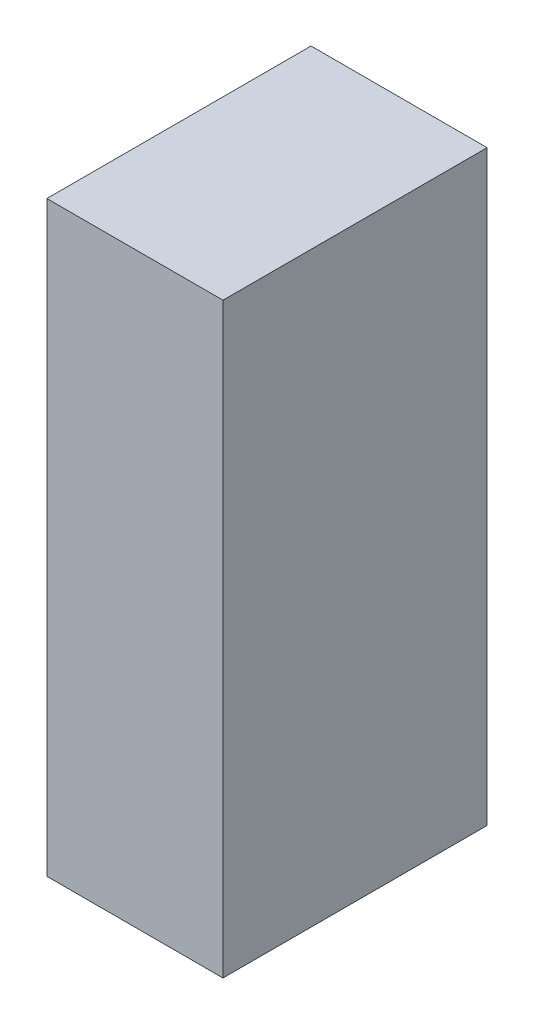
ISO-10303-21;
HEADER;
FILE_DESCRIPTION(('STEP AP214'),'2;1');
FILE_NAME('part.step','',(''),(''),'','','');
FILE_SCHEMA(('AUTOMOTIVE_DESIGN { 1 0 10303 214 1 1 1 1 }'));
ENDSEC;
DATA;
#1=APPLICATION_CONTEXT('core data for automotive mechanical design processes');
#2=APPLICATION_PROTOCOL_DEFINITION('international standard','automotive_design',2000,#1);
#3=PRODUCT_CONTEXT('',#1,'mechanical');
#4=PRODUCT('Part','Part','',(#3));
#5=PRODUCT_RELATED_PRODUCT_CATEGORY('part','',(#4));
#6=PRODUCT_DEFINITION_FORMATION('','',#4);
#7=PRODUCT_DEFINITION_CONTEXT('part definition',#1,'design');
#8=PRODUCT_DEFINITION('design','',#6,#7);
#9=PRODUCT_DEFINITION_SHAPE('','',#8);
#10=(LENGTH_UNIT() NAMED_UNIT(*) SI_UNIT(.MILLI.,.METRE.));
#11=(NAMED_UNIT(*) PLANE_ANGLE_UNIT() SI_UNIT($,.RADIAN.));
#12=(NAMED_UNIT(*) SI_UNIT($,.STERADIAN.) SOLID_ANGLE_UNIT());
#13=UNCERTAINTY_MEASURE_WITH_UNIT(LENGTH_MEASURE(1.E-05),#10,'distance_accuracy_value','');
#14=(GEOMETRIC_REPRESENTATION_CONTEXT(3) GLOBAL_UNCERTAINTY_ASSIGNED_CONTEXT((#13)) GLOBAL_UNIT_ASSIGNED_CONTEXT((#10,
#11,#12)) REPRESENTATION_CONTEXT('',''));
#15=CARTESIAN_POINT('',(0.,0.,0.));
#16=DIRECTION('',(0.,0.,1.));
#17=DIRECTION('',(1.,0.,0.));
#18=AXIS2_PLACEMENT_3D('',#15,#16,#17);
#19=CARTESIAN_POINT('',(2234.81781376517,80000.,36000.));
#20=DIRECTION('',(1.,0.,0.));
#21=DIRECTION('',(0.,1.,0.));
#22=AXIS2_PLACEMENT_3D('',#19,#20,#21);
#23=PLANE('',#22);
#24=DIRECTION('',(0.,-1.,0.));
#25=VECTOR('',#24,1.);
#26=CARTESIAN_POINT('',(2234.81781376517,80000.,0.));
#27=LINE('',#26,#25);
#28=CARTESIAN_POINT('',(2234.81781376517,80000.,0.));
#29=VERTEX_POINT('',#28);
#30=CARTESIAN_POINT('',(2234.81781376518,0.,0.));
#31=VERTEX_POINT('',#30);
#32=EDGE_CURVE('E96',#29,#31,#27,.T.);
#33=ORIENTED_EDGE('',*,*,#32,.T.);
#34=DIRECTION('',(0.,0.,-1.));
#35=VECTOR('',#34,1.);
#36=CARTESIAN_POINT('',(2234.81781376518,0.,36000.));
#37=LINE('',#36,#35);
#38=CARTESIAN_POINT('',(2234.81781376518,0.,36000.));
#39=VERTEX_POINT('',#38);
#40=EDGE_CURVE('E11',#39,#31,#37,.T.);
#41=ORIENTED_EDGE('',*,*,#40,.F.);
#42=DIRECTION('',(0.,-1.,0.));
#43=VECTOR('',#42,1.);
#44=CARTESIAN_POINT('',(2234.81781376517,80000.,36000.));
#45=LINE('',#44,#43);
#46=CARTESIAN_POINT('',(2234.81781376517,80000.,36000.));
#47=VERTEX_POINT('',#46);
#48=EDGE_CURVE('E84',#47,#39,#45,.T.);
#49=ORIENTED_EDGE('',*,*,#48,.F.);
#50=DIRECTION('',(0.,0.,-1.));
#51=VECTOR('',#50,1.);
#52=CARTESIAN_POINT('',(2234.81781376517,80000.,36000.));
#53=LINE('',#52,#51);
#54=EDGE_CURVE('E92',#47,#29,#53,.T.);
#55=ORIENTED_EDGE('',*,*,#54,.T.);
#56=EDGE_LOOP('',(#33,#41,#49,#55));
#57=FACE_BOUND('',#56,.T.);
#58=ADVANCED_FACE('F33',(#57),#23,.F.);
#59=CARTESIAN_POINT('',(2234.81781376518,0.,36000.));
#60=DIRECTION('',(0.,1.,0.));
#61=DIRECTION('',(0.,0.,1.));
#62=AXIS2_PLACEMENT_3D('',#59,#60,#61);
#63=PLANE('',#62);
#64=DIRECTION('',(1.,0.,0.));
#65=VECTOR('',#64,1.);
#66=CARTESIAN_POINT('',(2234.81781376518,0.,0.));
#67=LINE('',#66,#65);
#68=CARTESIAN_POINT('',(26234.8178137652,0.,0.));
#69=VERTEX_POINT('',#68);
#70=EDGE_CURVE('E88',#31,#69,#67,.T.);
#71=ORIENTED_EDGE('',*,*,#70,.T.);
#72=DIRECTION('',(0.,0.,-1.));
#73=VECTOR('',#72,1.);
#74=CARTESIAN_POINT('',(26234.8178137652,0.,36000.));
#75=LINE('',#74,#73);
#76=CARTESIAN_POINT('',(26234.8178137652,0.,36000.));
#77=VERTEX_POINT('',#76);
#78=EDGE_CURVE('E41',#77,#69,#75,.T.);
#79=ORIENTED_EDGE('',*,*,#78,.F.);
#80=DIRECTION('',(1.,0.,0.));
#81=VECTOR('',#80,1.);
#82=CARTESIAN_POINT('',(2234.81781376518,0.,36000.));
#83=LINE('',#82,#81);
#84=EDGE_CURVE('E79',#39,#77,#83,.T.);
#85=ORIENTED_EDGE('',*,*,#84,.F.);
#86=ORIENTED_EDGE('',*,*,#40,.T.);
#87=EDGE_LOOP('',(#71,#79,#85,#86));
#88=FACE_BOUND('',#87,.T.);
#89=ADVANCED_FACE('F87',(#88),#63,.F.);
#90=CARTESIAN_POINT('',(26234.8178137652,0.,36000.));
#91=DIRECTION('',(-1.,0.,0.));
#92=DIRECTION('',(0.,0.,1.));
#93=AXIS2_PLACEMENT_3D('',#90,#91,#92);
#94=PLANE('',#93);
#95=DIRECTION('',(0.,1.,0.));
#96=VECTOR('',#95,1.);
#97=CARTESIAN_POINT('',(26234.8178137652,0.,0.));
#98=LINE('',#97,#96);
#99=CARTESIAN_POINT('',(26234.8178137652,80000.,0.));
#100=VERTEX_POINT('',#99);
#101=EDGE_CURVE('E66',#69,#100,#98,.T.);
#102=ORIENTED_EDGE('',*,*,#101,.T.);
#103=DIRECTION('',(0.,0.,-1.));
#104=VECTOR('',#103,1.);
#105=CARTESIAN_POINT('',(26234.8178137652,80000.,36000.));
#106=LINE('',#105,#104);
#107=CARTESIAN_POINT('',(26234.8178137652,80000.,36000.));
#108=VERTEX_POINT('',#107);
#109=EDGE_CURVE('E89',#108,#100,#106,.T.);
#110=ORIENTED_EDGE('',*,*,#109,.F.);
#111=DIRECTION('',(0.,1.,0.));
#112=VECTOR('',#111,1.);
#113=CARTESIAN_POINT('',(26234.8178137652,0.,36000.));
#114=LINE('',#113,#112);
#115=EDGE_CURVE('E82',#77,#108,#114,.T.);
#116=ORIENTED_EDGE('',*,*,#115,.F.);
#117=ORIENTED_EDGE('',*,*,#78,.T.);
#118=EDGE_LOOP('',(#102,#110,#116,#117));
#119=FACE_BOUND('',#118,.T.);
#120=ADVANCED_FACE('F90',(#119),#94,.F.);
#121=CARTESIAN_POINT('',(26234.8178137652,80000.,36000.));
#122=DIRECTION('',(0.,-1.,0.));
#123=DIRECTION('',(0.,0.,-1.));
#124=AXIS2_PLACEMENT_3D('',#121,#122,#123);
#125=PLANE('',#124);
#126=DIRECTION('',(-1.,0.,0.));
#127=VECTOR('',#126,1.);
#128=CARTESIAN_POINT('',(26234.8178137652,80000.,0.));
#129=LINE('',#128,#127);
#130=EDGE_CURVE('E72',#100,#29,#129,.T.);
#131=ORIENTED_EDGE('',*,*,#130,.T.);
#132=ORIENTED_EDGE('',*,*,#54,.F.);
#133=DIRECTION('',(-1.,0.,0.));
#134=VECTOR('',#133,1.);
#135=CARTESIAN_POINT('',(26234.8178137652,80000.,36000.));
#136=LINE('',#135,#134);
#137=EDGE_CURVE('E49',#108,#47,#136,.T.);
#138=ORIENTED_EDGE('',*,*,#137,.F.);
#139=ORIENTED_EDGE('',*,*,#109,.T.);
#140=EDGE_LOOP('',(#131,#132,#138,#139));
#141=FACE_BOUND('',#140,.T.);
#142=ADVANCED_FACE('F103',(#141),#125,.F.);
#143=CARTESIAN_POINT('',(0.,0.,36000.));
#144=DIRECTION('',(0.,0.,1.));
#145=DIRECTION('',(1.,0.,0.));
#146=AXIS2_PLACEMENT_3D('',#143,#144,#145);
#147=PLANE('',#146);
#148=ORIENTED_EDGE('',*,*,#48,.T.);
#149=ORIENTED_EDGE('',*,*,#84,.T.);
#150=ORIENTED_EDGE('',*,*,#115,.T.);
#151=ORIENTED_EDGE('',*,*,#137,.T.);
#152=EDGE_LOOP('',(#148,#149,#150,#151));
#153=FACE_BOUND('',#152,.T.);
#154=ADVANCED_FACE('F80',(#153),#147,.T.);
#155=CARTESIAN_POINT('',(0.,0.,0.));
#156=DIRECTION('',(0.,0.,1.));
#157=DIRECTION('',(1.,0.,0.));
#158=AXIS2_PLACEMENT_3D('',#155,#156,#157);
#159=PLANE('',#158);
#160=ORIENTED_EDGE('',*,*,#32,.F.);
#161=ORIENTED_EDGE('',*,*,#130,.F.);
#162=ORIENTED_EDGE('',*,*,#101,.F.);
#163=ORIENTED_EDGE('',*,*,#70,.F.);
#164=EDGE_LOOP('',(#160,#161,#162,#163));
#165=FACE_BOUND('',#164,.T.);
#166=ADVANCED_FACE('F106',(#165),#159,.F.);
#167=CLOSED_SHELL('',(#58,#89,#120,#142,#154,#166));
#168=MANIFOLD_SOLID_BREP('B2',#167);
#169=ADVANCED_BREP_SHAPE_REPRESENTATION('',(#18,#168),#14);
#170=SHAPE_DEFINITION_REPRESENTATION(#9,#169);
ENDSEC;
END-ISO-10303-21;
